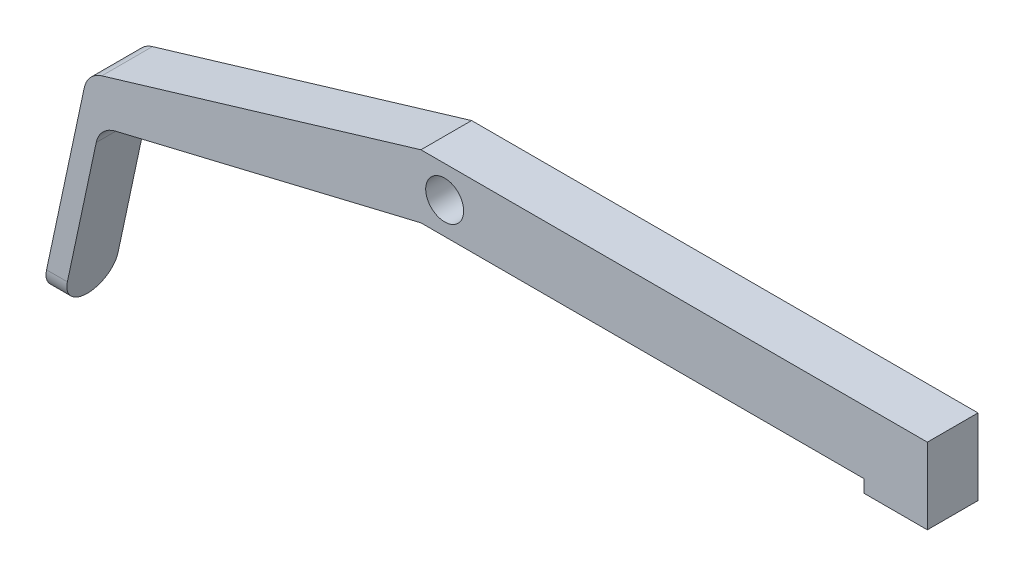
ISO-10303-21;
HEADER;
FILE_DESCRIPTION(('STEP AP214'),'2;1');
FILE_NAME('part.step','',(''),(''),'','','');
FILE_SCHEMA(('AUTOMOTIVE_DESIGN { 1 0 10303 214 1 1 1 1 }'));
ENDSEC;
DATA;
#1=APPLICATION_CONTEXT('core data for automotive mechanical design processes');
#2=APPLICATION_PROTOCOL_DEFINITION('international standard','automotive_design',2000,#1);
#3=PRODUCT_CONTEXT('',#1,'mechanical');
#4=PRODUCT('Part','Part','',(#3));
#5=PRODUCT_RELATED_PRODUCT_CATEGORY('part','',(#4));
#6=PRODUCT_DEFINITION_FORMATION('','',#4);
#7=PRODUCT_DEFINITION_CONTEXT('part definition',#1,'design');
#8=PRODUCT_DEFINITION('design','',#6,#7);
#9=PRODUCT_DEFINITION_SHAPE('','',#8);
#10=(LENGTH_UNIT() NAMED_UNIT(*) SI_UNIT(.MILLI.,.METRE.));
#11=(NAMED_UNIT(*) PLANE_ANGLE_UNIT() SI_UNIT($,.RADIAN.));
#12=(NAMED_UNIT(*) SI_UNIT($,.STERADIAN.) SOLID_ANGLE_UNIT());
#13=UNCERTAINTY_MEASURE_WITH_UNIT(LENGTH_MEASURE(1.E-05),#10,'distance_accuracy_value','');
#14=(GEOMETRIC_REPRESENTATION_CONTEXT(3) GLOBAL_UNCERTAINTY_ASSIGNED_CONTEXT((#13)) GLOBAL_UNIT_ASSIGNED_CONTEXT((#10,
#11,#12)) REPRESENTATION_CONTEXT('',''));
#15=CARTESIAN_POINT('',(0.,0.,0.));
#16=DIRECTION('',(0.,0.,1.));
#17=DIRECTION('',(1.,0.,0.));
#18=AXIS2_PLACEMENT_3D('',#15,#16,#17);
#19=CARTESIAN_POINT('',(-118.155372005352,47.283765903009,8.));
#20=DIRECTION('',(0.,1.,0.));
#21=DIRECTION('',(-1.,0.,0.));
#22=AXIS2_PLACEMENT_3D('',#19,#20,#21);
#23=PLANE('',#22);
#24=DIRECTION('',(0.,0.,-1.));
#25=VECTOR('',#24,1.);
#26=CARTESIAN_POINT('',(-128.155372005352,47.283765903009,0.));
#27=LINE('',#26,#25);
#28=CARTESIAN_POINT('',(-128.155372005352,47.283765903009,8.));
#29=VERTEX_POINT('',#28);
#30=CARTESIAN_POINT('',(-128.155372005352,47.283765903009,6.5));
#31=VERTEX_POINT('',#30);
#32=EDGE_CURVE('E277',#29,#31,#27,.T.);
#33=ORIENTED_EDGE('',*,*,#32,.F.);
#34=DIRECTION('',(1.,0.,0.));
#35=VECTOR('',#34,1.);
#36=CARTESIAN_POINT('',(-118.155372005352,47.283765903009,8.));
#37=LINE('',#36,#35);
#38=CARTESIAN_POINT('',(-198.155372005352,47.2837659030089,8.));
#39=VERTEX_POINT('',#38);
#40=EDGE_CURVE('E186',#39,#29,#37,.T.);
#41=ORIENTED_EDGE('',*,*,#40,.F.);
#42=DIRECTION('',(0.,0.,-1.));
#43=VECTOR('',#42,1.);
#44=CARTESIAN_POINT('',(-198.155372005352,47.2837659030089,8.));
#45=LINE('',#44,#43);
#46=CARTESIAN_POINT('',(-198.155372005352,47.2837659030089,0.));
#47=VERTEX_POINT('',#46);
#48=EDGE_CURVE('E211',#39,#47,#45,.T.);
#49=ORIENTED_EDGE('',*,*,#48,.T.);
#50=DIRECTION('',(1.,0.,0.));
#51=VECTOR('',#50,1.);
#52=CARTESIAN_POINT('',(-118.155372005352,47.283765903009,0.));
#53=LINE('',#52,#51);
#54=CARTESIAN_POINT('',(-128.155372005352,47.283765903009,0.));
#55=VERTEX_POINT('',#54);
#56=EDGE_CURVE('E199',#47,#55,#53,.T.);
#57=ORIENTED_EDGE('',*,*,#56,.T.);
#58=DIRECTION('',(0.,0.,1.));
#59=VECTOR('',#58,1.);
#60=CARTESIAN_POINT('',(-128.155372005352,47.283765903009,0.));
#61=LINE('',#60,#59);
#62=CARTESIAN_POINT('',(-128.155372005352,47.283765903009,1.5));
#63=VERTEX_POINT('',#62);
#64=EDGE_CURVE('E181',#55,#63,#61,.T.);
#65=ORIENTED_EDGE('',*,*,#64,.T.);
#66=DIRECTION('',(-1.,0.,0.));
#67=VECTOR('',#66,1.);
#68=CARTESIAN_POINT('',(0.,47.283765903009,1.50000000000001));
#69=LINE('',#68,#67);
#70=CARTESIAN_POINT('',(-119.655372005352,47.283765903009,1.5));
#71=VERTEX_POINT('',#70);
#72=EDGE_CURVE('E292',#71,#63,#69,.T.);
#73=ORIENTED_EDGE('',*,*,#72,.F.);
#74=DIRECTION('',(0.,0.,-1.));
#75=VECTOR('',#74,1.);
#76=CARTESIAN_POINT('',(-119.655372005352,47.283765903009,0.));
#77=LINE('',#76,#75);
#78=CARTESIAN_POINT('',(-119.655372005352,47.283765903009,6.5));
#79=VERTEX_POINT('',#78);
#80=EDGE_CURVE('E282',#79,#71,#77,.T.);
#81=ORIENTED_EDGE('',*,*,#80,.F.);
#82=DIRECTION('',(-1.,0.,0.));
#83=VECTOR('',#82,1.);
#84=CARTESIAN_POINT('',(0.,47.283765903009,6.49999999999999));
#85=LINE('',#84,#83);
#86=EDGE_CURVE('E279',#79,#31,#85,.T.);
#87=ORIENTED_EDGE('',*,*,#86,.T.);
#88=EDGE_LOOP('',(#33,#41,#49,#57,#65,#73,#81,#87));
#89=FACE_BOUND('',#88,.T.);
#90=ADVANCED_FACE('F38',(#89),#23,.F.);
#91=CARTESIAN_POINT('',(-118.155372005352,57.283765903009,8.));
#92=DIRECTION('',(-1.,0.,0.));
#93=DIRECTION('',(0.,0.,1.));
#94=AXIS2_PLACEMENT_3D('',#91,#92,#93);
#95=PLANE('',#94);
#96=DIRECTION('',(0.,1.,0.));
#97=VECTOR('',#96,1.);
#98=CARTESIAN_POINT('',(-118.155372005352,57.283765903009,0.));
#99=LINE('',#98,#97);
#100=CARTESIAN_POINT('',(-118.155372005352,45.283765903009,0.));
#101=VERTEX_POINT('',#100);
#102=CARTESIAN_POINT('',(-118.155372005352,57.283765903009,0.));
#103=VERTEX_POINT('',#102);
#104=EDGE_CURVE('E187',#101,#103,#99,.T.);
#105=ORIENTED_EDGE('',*,*,#104,.T.);
#106=DIRECTION('',(0.,0.,-1.));
#107=VECTOR('',#106,1.);
#108=CARTESIAN_POINT('',(-118.155372005352,57.283765903009,8.));
#109=LINE('',#108,#107);
#110=CARTESIAN_POINT('',(-118.155372005352,57.283765903009,8.));
#111=VERTEX_POINT('',#110);
#112=EDGE_CURVE('E230',#111,#103,#109,.T.);
#113=ORIENTED_EDGE('',*,*,#112,.F.);
#114=DIRECTION('',(0.,1.,0.));
#115=VECTOR('',#114,1.);
#116=CARTESIAN_POINT('',(-118.155372005352,57.283765903009,8.));
#117=LINE('',#116,#115);
#118=CARTESIAN_POINT('',(-118.155372005352,45.283765903009,8.));
#119=VERTEX_POINT('',#118);
#120=EDGE_CURVE('E196',#119,#111,#117,.T.);
#121=ORIENTED_EDGE('',*,*,#120,.F.);
#122=DIRECTION('',(0.,0.,1.));
#123=VECTOR('',#122,1.);
#124=CARTESIAN_POINT('',(-118.155372005352,45.283765903009,0.));
#125=LINE('',#124,#123);
#126=EDGE_CURVE('E178',#101,#119,#125,.T.);
#127=ORIENTED_EDGE('',*,*,#126,.F.);
#128=EDGE_LOOP('',(#105,#113,#121,#127));
#129=FACE_BOUND('',#128,.T.);
#130=ADVANCED_FACE('F323',(#129),#95,.F.);
#131=CARTESIAN_POINT('',(-118.155372005352,57.283765903009,8.));
#132=DIRECTION('',(0.,-1.,0.));
#133=DIRECTION('',(1.,0.,0.));
#134=AXIS2_PLACEMENT_3D('',#131,#132,#133);
#135=PLANE('',#134);
#136=DIRECTION('',(-1.,0.,0.));
#137=VECTOR('',#136,1.);
#138=CARTESIAN_POINT('',(-118.155372005352,57.283765903009,0.));
#139=LINE('',#138,#137);
#140=CARTESIAN_POINT('',(-198.155372005352,57.283765903009,0.));
#141=VERTEX_POINT('',#140);
#142=EDGE_CURVE('E190',#103,#141,#139,.T.);
#143=ORIENTED_EDGE('',*,*,#142,.T.);
#144=DIRECTION('',(0.,0.,-1.));
#145=VECTOR('',#144,1.);
#146=CARTESIAN_POINT('',(-198.155372005352,57.283765903009,8.));
#147=LINE('',#146,#145);
#148=CARTESIAN_POINT('',(-198.155372005352,57.283765903009,8.));
#149=VERTEX_POINT('',#148);
#150=EDGE_CURVE('E227',#149,#141,#147,.T.);
#151=ORIENTED_EDGE('',*,*,#150,.F.);
#152=DIRECTION('',(-1.,0.,0.));
#153=VECTOR('',#152,1.);
#154=CARTESIAN_POINT('',(-118.155372005352,57.283765903009,8.));
#155=LINE('',#154,#153);
#156=EDGE_CURVE('E198',#111,#149,#155,.T.);
#157=ORIENTED_EDGE('',*,*,#156,.F.);
#158=ORIENTED_EDGE('',*,*,#112,.T.);
#159=EDGE_LOOP('',(#143,#151,#157,#158));
#160=FACE_BOUND('',#159,.T.);
#161=ADVANCED_FACE('F328',(#160),#135,.F.);
#162=CARTESIAN_POINT('',(-198.155372005352,57.283765903009,8.));
#163=DIRECTION('',(0.286761078698048,-0.95800213138799,0.));
#164=DIRECTION('',(0.95800213138799,0.286761078698048,0.));
#165=AXIS2_PLACEMENT_3D('',#162,#163,#164);
#166=PLANE('',#165);
#167=DIRECTION('',(-0.95800213138799,-0.286761078698048,0.));
#168=VECTOR('',#167,1.);
#169=CARTESIAN_POINT('',(-198.155372005352,57.283765903009,0.));
#170=LINE('',#169,#168);
#171=CARTESIAN_POINT('',(-248.575603282018,42.1913569872234,0.));
#172=VERTEX_POINT('',#171);
#173=EDGE_CURVE('E214',#141,#172,#170,.T.);
#174=ORIENTED_EDGE('',*,*,#173,.T.);
#175=DIRECTION('',(0.,0.,-1.));
#176=VECTOR('',#175,1.);
#177=CARTESIAN_POINT('',(-248.575603282018,42.1913569872234,8.));
#178=LINE('',#177,#176);
#179=CARTESIAN_POINT('',(-248.575603282018,42.1913569872234,8.));
#180=VERTEX_POINT('',#179);
#181=EDGE_CURVE('E54',#172,#180,#178,.F.);
#182=ORIENTED_EDGE('',*,*,#181,.T.);
#183=DIRECTION('',(-0.95800213138799,-0.286761078698048,0.));
#184=VECTOR('',#183,1.);
#185=CARTESIAN_POINT('',(-198.155372005352,57.283765903009,8.));
#186=LINE('',#185,#184);
#187=EDGE_CURVE('E201',#149,#180,#186,.T.);
#188=ORIENTED_EDGE('',*,*,#187,.F.);
#189=ORIENTED_EDGE('',*,*,#150,.T.);
#190=EDGE_LOOP('',(#174,#182,#188,#189));
#191=FACE_BOUND('',#190,.T.);
#192=ADVANCED_FACE('F329',(#191),#166,.F.);
#193=CARTESIAN_POINT('',(-250.845489231691,41.5119065746163,8.));
#194=DIRECTION('',(0.977946876331638,-0.208853793533158,0.));
#195=DIRECTION('',(0.208853793533158,0.977946876331639,0.));
#196=AXIS2_PLACEMENT_3D('',#193,#194,#195);
#197=PLANE('',#196);
#198=DIRECTION('',(-0.208853793533158,-0.977946876331638,0.));
#199=VECTOR('',#198,1.);
#200=CARTESIAN_POINT('',(-250.845489231691,41.5119065746163,8.));
#201=LINE('',#200,#199);
#202=CARTESIAN_POINT('',(-251.340346472552,39.1947636358041,8.));
#203=VERTEX_POINT('',#202);
#204=CARTESIAN_POINT('',(-257.301117858883,11.283765903009,8.));
#205=VERTEX_POINT('',#204);
#206=EDGE_CURVE('E203',#203,#205,#201,.T.);
#207=ORIENTED_EDGE('',*,*,#206,.F.);
#208=DIRECTION('',(0.,0.,-1.));
#209=VECTOR('',#208,1.);
#210=CARTESIAN_POINT('',(-251.340346472552,39.1947636358041,8.));
#211=LINE('',#210,#209);
#212=CARTESIAN_POINT('',(-251.340346472552,39.1947636358041,0.));
#213=VERTEX_POINT('',#212);
#214=EDGE_CURVE('E246',#203,#213,#211,.T.);
#215=ORIENTED_EDGE('',*,*,#214,.T.);
#216=DIRECTION('',(-0.208853793533158,-0.977946876331638,0.));
#217=VECTOR('',#216,1.);
#218=CARTESIAN_POINT('',(-250.845489231691,41.5119065746163,0.));
#219=LINE('',#218,#217);
#220=CARTESIAN_POINT('',(-257.301117858883,11.283765903009,0.));
#221=VERTEX_POINT('',#220);
#222=EDGE_CURVE('E216',#213,#221,#219,.T.);
#223=ORIENTED_EDGE('',*,*,#222,.T.);
#224=CARTESIAN_POINT('',(-257.301117858883,11.283765903009,4.));
#225=DIRECTION('',(0.977946876331638,-0.208853793533158,0.));
#226=DIRECTION('',(-0.208853793533158,-0.977946876331639,0.));
#227=AXIS2_PLACEMENT_3D('',#224,#225,#226);
#228=ELLIPSE('',#227,4.09020172445802,4.);
#229=CARTESIAN_POINT('',(-258.155372005352,7.28376590300896,4.));
#230=VERTEX_POINT('',#229);
#231=EDGE_CURVE('E244',#221,#230,#228,.F.);
#232=ORIENTED_EDGE('',*,*,#231,.T.);
#233=CARTESIAN_POINT('',(-257.301117858883,11.283765903009,4.));
#234=DIRECTION('',(0.977946876331638,-0.208853793533158,0.));
#235=DIRECTION('',(0.208853793533158,0.977946876331639,0.));
#236=AXIS2_PLACEMENT_3D('',#233,#234,#235);
#237=ELLIPSE('',#236,4.09020172445802,4.);
#238=EDGE_CURVE('E242',#230,#205,#237,.F.);
#239=ORIENTED_EDGE('',*,*,#238,.T.);
#240=EDGE_LOOP('',(#207,#215,#223,#232,#239));
#241=FACE_BOUND('',#240,.T.);
#242=ADVANCED_FACE('F331',(#241),#197,.F.);
#243=CARTESIAN_POINT('',(-248.926231581606,35.1001127293261,8.));
#244=DIRECTION('',(-0.977946876331638,0.208853793533158,0.));
#245=DIRECTION('',(-0.208853793533158,-0.977946876331639,0.));
#246=AXIS2_PLACEMENT_3D('',#243,#244,#245);
#247=PLANE('',#246);
#248=DIRECTION('',(0.208853793533158,0.977946876331638,0.));
#249=VECTOR('',#248,1.);
#250=CARTESIAN_POINT('',(-248.926231581606,35.1001127293261,0.));
#251=LINE('',#250,#249);
#252=CARTESIAN_POINT('',(-254.012534839136,11.283765903009,0.));
#253=VERTEX_POINT('',#252);
#254=CARTESIAN_POINT('',(-249.452835110038,32.6343194727909,0.));
#255=VERTEX_POINT('',#254);
#256=EDGE_CURVE('E219',#253,#255,#251,.T.);
#257=ORIENTED_EDGE('',*,*,#256,.T.);
#258=DIRECTION('',(0.,0.,-1.));
#259=VECTOR('',#258,1.);
#260=CARTESIAN_POINT('',(-249.452835110038,32.6343194727909,8.));
#261=LINE('',#260,#259);
#262=CARTESIAN_POINT('',(-249.452835110038,32.6343194727909,8.));
#263=VERTEX_POINT('',#262);
#264=EDGE_CURVE('E240',#255,#263,#261,.F.);
#265=ORIENTED_EDGE('',*,*,#264,.T.);
#266=DIRECTION('',(0.208853793533158,0.977946876331638,0.));
#267=VECTOR('',#266,1.);
#268=CARTESIAN_POINT('',(-248.926231581606,35.1001127293261,8.));
#269=LINE('',#268,#267);
#270=CARTESIAN_POINT('',(-254.012534839136,11.283765903009,8.));
#271=VERTEX_POINT('',#270);
#272=EDGE_CURVE('E206',#271,#263,#269,.T.);
#273=ORIENTED_EDGE('',*,*,#272,.F.);
#274=CARTESIAN_POINT('',(-254.012534839136,11.283765903009,4.));
#275=DIRECTION('',(-0.977946876331638,0.208853793533158,0.));
#276=DIRECTION('',(0.208853793533158,0.977946876331639,0.));
#277=AXIS2_PLACEMENT_3D('',#274,#275,#276);
#278=ELLIPSE('',#277,4.09020172445802,4.);
#279=CARTESIAN_POINT('',(-254.866788985605,7.28376590300896,4.));
#280=VERTEX_POINT('',#279);
#281=EDGE_CURVE('E236',#271,#280,#278,.F.);
#282=ORIENTED_EDGE('',*,*,#281,.T.);
#283=CARTESIAN_POINT('',(-254.012534839136,11.283765903009,4.));
#284=DIRECTION('',(-0.977946876331638,0.208853793533158,0.));
#285=DIRECTION('',(-0.208853793533158,-0.977946876331639,0.));
#286=AXIS2_PLACEMENT_3D('',#283,#284,#285);
#287=ELLIPSE('',#286,4.09020172445802,4.);
#288=EDGE_CURVE('E238',#280,#253,#287,.F.);
#289=ORIENTED_EDGE('',*,*,#288,.T.);
#290=EDGE_LOOP('',(#257,#265,#273,#282,#289));
#291=FACE_BOUND('',#290,.T.);
#292=ADVANCED_FACE('F267',(#291),#247,.F.);
#293=CARTESIAN_POINT('',(-198.155372005352,47.2837659030089,8.));
#294=DIRECTION('',(-0.233348448019879,0.972393182723282,0.));
#295=DIRECTION('',(-0.972393182723282,-0.233348448019879,0.));
#296=AXIS2_PLACEMENT_3D('',#293,#294,#295);
#297=PLANE('',#296);
#298=DIRECTION('',(0.972393182723282,0.233348448019879,0.));
#299=VECTOR('',#298,1.);
#300=CARTESIAN_POINT('',(-198.155372005352,47.2837659030089,8.));
#301=LINE('',#300,#299);
#302=CARTESIAN_POINT('',(-246.474441396791,35.6884770295514,8.));
#303=VERTEX_POINT('',#302);
#304=EDGE_CURVE('E209',#303,#39,#301,.T.);
#305=ORIENTED_EDGE('',*,*,#304,.F.);
#306=DIRECTION('',(0.,0.,-1.));
#307=VECTOR('',#306,1.);
#308=CARTESIAN_POINT('',(-246.474441396791,35.6884770295514,0.));
#309=LINE('',#308,#307);
#310=CARTESIAN_POINT('',(-246.474441396791,35.6884770295514,0.));
#311=VERTEX_POINT('',#310);
#312=EDGE_CURVE('E233',#303,#311,#309,.T.);
#313=ORIENTED_EDGE('',*,*,#312,.T.);
#314=DIRECTION('',(0.972393182723282,0.233348448019879,0.));
#315=VECTOR('',#314,1.);
#316=CARTESIAN_POINT('',(-198.155372005352,47.2837659030089,0.));
#317=LINE('',#316,#315);
#318=EDGE_CURVE('E222',#311,#47,#317,.T.);
#319=ORIENTED_EDGE('',*,*,#318,.T.);
#320=ORIENTED_EDGE('',*,*,#48,.F.);
#321=EDGE_LOOP('',(#305,#313,#319,#320));
#322=FACE_BOUND('',#321,.T.);
#323=ADVANCED_FACE('F275',(#322),#297,.F.);
#324=CARTESIAN_POINT('',(0.,0.,8.));
#325=DIRECTION('',(0.,0.,-1.));
#326=DIRECTION('',(-1.,0.,0.));
#327=AXIS2_PLACEMENT_3D('',#324,#325,#326);
#328=PLANE('',#327);
#329=CARTESIAN_POINT('',(-194.405761522384,52.2863882838188,8.));
#330=DIRECTION('',(0.,0.,1.));
#331=DIRECTION('',(1.,0.,0.));
#332=AXIS2_PLACEMENT_3D('',#329,#330,#331);
#333=CIRCLE('',#332,2.99999999999999);
#334=CARTESIAN_POINT('',(-191.405761522384,52.2863882838188,8.));
#335=VERTEX_POINT('',#334);
#336=EDGE_CURVE('E285',#335,#335,#333,.T.);
#337=ORIENTED_EDGE('',*,*,#336,.F.);
#338=EDGE_LOOP('',(#337));
#339=FACE_BOUND('',#338,.T.);
#340=ORIENTED_EDGE('',*,*,#187,.T.);
#341=CARTESIAN_POINT('',(-247.428558967225,38.3593484616714,8.));
#342=DIRECTION('',(0.,0.,-1.));
#343=DIRECTION('',(-1.,0.,0.));
#344=AXIS2_PLACEMENT_3D('',#341,#342,#343);
#345=CIRCLE('',#344,4.);
#346=EDGE_CURVE('E256',#180,#203,#345,.F.);
#347=ORIENTED_EDGE('',*,*,#346,.T.);
#348=ORIENTED_EDGE('',*,*,#206,.T.);
#349=DIRECTION('',(1.,0.,0.));
#350=VECTOR('',#349,1.);
#351=CARTESIAN_POINT('',(0.,11.283765903009,8.));
#352=LINE('',#351,#350);
#353=EDGE_CURVE('E254',#205,#271,#352,.T.);
#354=ORIENTED_EDGE('',*,*,#353,.T.);
#355=ORIENTED_EDGE('',*,*,#272,.T.);
#356=CARTESIAN_POINT('',(-245.541047604712,31.7989042986583,8.));
#357=DIRECTION('',(0.,0.,-1.));
#358=DIRECTION('',(-1.,0.,0.));
#359=AXIS2_PLACEMENT_3D('',#356,#357,#358);
#360=CIRCLE('',#359,4.);
#361=EDGE_CURVE('E11',#263,#303,#360,.T.);
#362=ORIENTED_EDGE('',*,*,#361,.T.);
#363=ORIENTED_EDGE('',*,*,#304,.T.);
#364=ORIENTED_EDGE('',*,*,#40,.T.);
#365=DIRECTION('',(0.,1.,0.));
#366=VECTOR('',#365,1.);
#367=CARTESIAN_POINT('',(-128.155372005352,45.283765903009,8.));
#368=LINE('',#367,#366);
#369=CARTESIAN_POINT('',(-128.155372005352,45.283765903009,8.));
#370=VERTEX_POINT('',#369);
#371=EDGE_CURVE('E164',#370,#29,#368,.T.);
#372=ORIENTED_EDGE('',*,*,#371,.F.);
#373=DIRECTION('',(-1.,0.,0.));
#374=VECTOR('',#373,1.);
#375=CARTESIAN_POINT('',(0.,45.283765903009,8.));
#376=LINE('',#375,#374);
#377=EDGE_CURVE('E171',#119,#370,#376,.T.);
#378=ORIENTED_EDGE('',*,*,#377,.F.);
#379=ORIENTED_EDGE('',*,*,#120,.T.);
#380=ORIENTED_EDGE('',*,*,#156,.T.);
#381=EDGE_LOOP('',(#340,#347,#348,#354,#355,#362,#363,#364,#372,#378,#379,#380));
#382=FACE_BOUND('',#381,.T.);
#383=ADVANCED_FACE('F184',(#339,#382),#328,.F.);
#384=CARTESIAN_POINT('',(0.,0.,0.));
#385=DIRECTION('',(0.,0.,-1.));
#386=DIRECTION('',(-1.,0.,0.));
#387=AXIS2_PLACEMENT_3D('',#384,#385,#386);
#388=PLANE('',#387);
#389=CARTESIAN_POINT('',(-194.405761522384,52.2863882838188,0.));
#390=DIRECTION('',(0.,0.,1.));
#391=DIRECTION('',(1.,0.,0.));
#392=AXIS2_PLACEMENT_3D('',#389,#390,#391);
#393=CIRCLE('',#392,2.99999999999999);
#394=CARTESIAN_POINT('',(-191.405761522384,52.2863882838188,0.));
#395=VERTEX_POINT('',#394);
#396=EDGE_CURVE('E280',#395,#395,#393,.T.);
#397=ORIENTED_EDGE('',*,*,#396,.T.);
#398=EDGE_LOOP('',(#397));
#399=FACE_BOUND('',#398,.T.);
#400=ORIENTED_EDGE('',*,*,#222,.F.);
#401=CARTESIAN_POINT('',(-247.428558967225,38.3593484616714,0.));
#402=DIRECTION('',(0.,0.,-1.));
#403=DIRECTION('',(-1.,0.,0.));
#404=AXIS2_PLACEMENT_3D('',#401,#402,#403);
#405=CIRCLE('',#404,4.);
#406=EDGE_CURVE('E62',#213,#172,#405,.T.);
#407=ORIENTED_EDGE('',*,*,#406,.T.);
#408=ORIENTED_EDGE('',*,*,#173,.F.);
#409=ORIENTED_EDGE('',*,*,#142,.F.);
#410=ORIENTED_EDGE('',*,*,#104,.F.);
#411=DIRECTION('',(1.,0.,0.));
#412=VECTOR('',#411,1.);
#413=CARTESIAN_POINT('',(0.,45.283765903009,0.));
#414=LINE('',#413,#412);
#415=CARTESIAN_POINT('',(-128.155372005352,45.283765903009,0.));
#416=VERTEX_POINT('',#415);
#417=EDGE_CURVE('E319',#416,#101,#414,.T.);
#418=ORIENTED_EDGE('',*,*,#417,.F.);
#419=DIRECTION('',(0.,1.,0.));
#420=VECTOR('',#419,1.);
#421=CARTESIAN_POINT('',(-128.155372005352,45.283765903009,0.));
#422=LINE('',#421,#420);
#423=EDGE_CURVE('E296',#416,#55,#422,.T.);
#424=ORIENTED_EDGE('',*,*,#423,.T.);
#425=ORIENTED_EDGE('',*,*,#56,.F.);
#426=ORIENTED_EDGE('',*,*,#318,.F.);
#427=CARTESIAN_POINT('',(-245.541047604712,31.7989042986583,0.));
#428=DIRECTION('',(0.,0.,-1.));
#429=DIRECTION('',(-1.,0.,0.));
#430=AXIS2_PLACEMENT_3D('',#427,#428,#429);
#431=CIRCLE('',#430,4.);
#432=EDGE_CURVE('E47',#311,#255,#431,.F.);
#433=ORIENTED_EDGE('',*,*,#432,.T.);
#434=ORIENTED_EDGE('',*,*,#256,.F.);
#435=DIRECTION('',(1.,0.,0.));
#436=VECTOR('',#435,1.);
#437=CARTESIAN_POINT('',(-258.155372005352,11.283765903009,0.));
#438=LINE('',#437,#436);
#439=EDGE_CURVE('E249',#253,#221,#438,.F.);
#440=ORIENTED_EDGE('',*,*,#439,.T.);
#441=EDGE_LOOP('',(#400,#407,#408,#409,#410,#418,#424,#425,#426,#433,#434,#440));
#442=FACE_BOUND('',#441,.T.);
#443=ADVANCED_FACE('F260',(#399,#442),#388,.T.);
#444=CARTESIAN_POINT('',(-128.155372005352,45.283765903009,0.));
#445=DIRECTION('',(1.,0.,0.));
#446=DIRECTION('',(0.,1.,0.));
#447=AXIS2_PLACEMENT_3D('',#444,#445,#446);
#448=PLANE('',#447);
#449=ORIENTED_EDGE('',*,*,#32,.T.);
#450=DIRECTION('',(0.,1.,0.));
#451=VECTOR('',#450,1.);
#452=CARTESIAN_POINT('',(-128.155372005352,45.283765903009,6.5));
#453=LINE('',#452,#451);
#454=CARTESIAN_POINT('',(-128.155372005352,45.283765903009,6.5));
#455=VERTEX_POINT('',#454);
#456=EDGE_CURVE('E166',#455,#31,#453,.T.);
#457=ORIENTED_EDGE('',*,*,#456,.F.);
#458=DIRECTION('',(0.,0.,-1.));
#459=VECTOR('',#458,1.);
#460=CARTESIAN_POINT('',(-128.155372005352,45.283765903009,0.));
#461=LINE('',#460,#459);
#462=EDGE_CURVE('E159',#370,#455,#461,.T.);
#463=ORIENTED_EDGE('',*,*,#462,.F.);
#464=ORIENTED_EDGE('',*,*,#371,.T.);
#465=EDGE_LOOP('',(#449,#457,#463,#464));
#466=FACE_BOUND('',#465,.T.);
#467=ADVANCED_FACE('F162',(#466),#448,.F.);
#468=CARTESIAN_POINT('',(0.,45.283765903009,6.49999999999999));
#469=DIRECTION('',(0.,0.,-1.));
#470=DIRECTION('',(-1.,0.,0.));
#471=AXIS2_PLACEMENT_3D('',#468,#469,#470);
#472=PLANE('',#471);
#473=ORIENTED_EDGE('',*,*,#86,.F.);
#474=DIRECTION('',(0.,1.,0.));
#475=VECTOR('',#474,1.);
#476=CARTESIAN_POINT('',(-119.655372005352,45.283765903009,6.5));
#477=LINE('',#476,#475);
#478=CARTESIAN_POINT('',(-119.655372005352,45.283765903009,6.5));
#479=VERTEX_POINT('',#478);
#480=EDGE_CURVE('E192',#479,#79,#477,.T.);
#481=ORIENTED_EDGE('',*,*,#480,.F.);
#482=DIRECTION('',(-1.,0.,0.));
#483=VECTOR('',#482,1.);
#484=CARTESIAN_POINT('',(0.,45.283765903009,6.49999999999999));
#485=LINE('',#484,#483);
#486=EDGE_CURVE('E170',#479,#455,#485,.T.);
#487=ORIENTED_EDGE('',*,*,#486,.T.);
#488=ORIENTED_EDGE('',*,*,#456,.T.);
#489=EDGE_LOOP('',(#473,#481,#487,#488));
#490=FACE_BOUND('',#489,.T.);
#491=ADVANCED_FACE('F311',(#490),#472,.T.);
#492=CARTESIAN_POINT('',(-119.655372005352,45.283765903009,0.));
#493=DIRECTION('',(1.,0.,0.));
#494=DIRECTION('',(0.,1.,0.));
#495=AXIS2_PLACEMENT_3D('',#492,#493,#494);
#496=PLANE('',#495);
#497=ORIENTED_EDGE('',*,*,#80,.T.);
#498=DIRECTION('',(0.,1.,0.));
#499=VECTOR('',#498,1.);
#500=CARTESIAN_POINT('',(-119.655372005352,45.283765903009,1.5));
#501=LINE('',#500,#499);
#502=CARTESIAN_POINT('',(-119.655372005352,45.283765903009,1.5));
#503=VERTEX_POINT('',#502);
#504=EDGE_CURVE('E302',#503,#71,#501,.T.);
#505=ORIENTED_EDGE('',*,*,#504,.F.);
#506=DIRECTION('',(0.,0.,-1.));
#507=VECTOR('',#506,1.);
#508=CARTESIAN_POINT('',(-119.655372005352,45.283765903009,0.));
#509=LINE('',#508,#507);
#510=EDGE_CURVE('E309',#479,#503,#509,.T.);
#511=ORIENTED_EDGE('',*,*,#510,.F.);
#512=ORIENTED_EDGE('',*,*,#480,.T.);
#513=EDGE_LOOP('',(#497,#505,#511,#512));
#514=FACE_BOUND('',#513,.T.);
#515=ADVANCED_FACE('F307',(#514),#496,.F.);
#516=CARTESIAN_POINT('',(0.,45.283765903009,1.50000000000001));
#517=DIRECTION('',(0.,0.,-1.));
#518=DIRECTION('',(-1.,0.,0.));
#519=AXIS2_PLACEMENT_3D('',#516,#517,#518);
#520=PLANE('',#519);
#521=ORIENTED_EDGE('',*,*,#72,.T.);
#522=DIRECTION('',(0.,1.,0.));
#523=VECTOR('',#522,1.);
#524=CARTESIAN_POINT('',(-128.155372005352,45.283765903009,1.5));
#525=LINE('',#524,#523);
#526=CARTESIAN_POINT('',(-128.155372005352,45.283765903009,1.5));
#527=VERTEX_POINT('',#526);
#528=EDGE_CURVE('E299',#527,#63,#525,.T.);
#529=ORIENTED_EDGE('',*,*,#528,.F.);
#530=DIRECTION('',(-1.,0.,0.));
#531=VECTOR('',#530,1.);
#532=CARTESIAN_POINT('',(0.,45.283765903009,1.50000000000001));
#533=LINE('',#532,#531);
#534=EDGE_CURVE('E313',#503,#527,#533,.T.);
#535=ORIENTED_EDGE('',*,*,#534,.F.);
#536=ORIENTED_EDGE('',*,*,#504,.T.);
#537=EDGE_LOOP('',(#521,#529,#535,#536));
#538=FACE_BOUND('',#537,.T.);
#539=ADVANCED_FACE('F392',(#538),#520,.F.);
#540=CARTESIAN_POINT('',(-128.155372005352,45.283765903009,0.));
#541=DIRECTION('',(-1.,0.,0.));
#542=DIRECTION('',(0.,-1.,0.));
#543=AXIS2_PLACEMENT_3D('',#540,#541,#542);
#544=PLANE('',#543);
#545=ORIENTED_EDGE('',*,*,#64,.F.);
#546=ORIENTED_EDGE('',*,*,#423,.F.);
#547=DIRECTION('',(0.,0.,1.));
#548=VECTOR('',#547,1.);
#549=CARTESIAN_POINT('',(-128.155372005352,45.283765903009,0.));
#550=LINE('',#549,#548);
#551=EDGE_CURVE('E317',#416,#527,#550,.T.);
#552=ORIENTED_EDGE('',*,*,#551,.T.);
#553=ORIENTED_EDGE('',*,*,#528,.T.);
#554=EDGE_LOOP('',(#545,#546,#552,#553));
#555=FACE_BOUND('',#554,.T.);
#556=ADVANCED_FACE('F399',(#555),#544,.T.);
#557=CARTESIAN_POINT('',(0.,45.283765903009,0.));
#558=DIRECTION('',(0.,-1.,0.));
#559=DIRECTION('',(1.,0.,0.));
#560=AXIS2_PLACEMENT_3D('',#557,#558,#559);
#561=PLANE('',#560);
#562=ORIENTED_EDGE('',*,*,#377,.T.);
#563=ORIENTED_EDGE('',*,*,#462,.T.);
#564=ORIENTED_EDGE('',*,*,#486,.F.);
#565=ORIENTED_EDGE('',*,*,#510,.T.);
#566=ORIENTED_EDGE('',*,*,#534,.T.);
#567=ORIENTED_EDGE('',*,*,#551,.F.);
#568=ORIENTED_EDGE('',*,*,#417,.T.);
#569=ORIENTED_EDGE('',*,*,#126,.T.);
#570=EDGE_LOOP('',(#562,#563,#564,#565,#566,#567,#568,#569));
#571=FACE_BOUND('',#570,.T.);
#572=ADVANCED_FACE('F175',(#571),#561,.T.);
#573=CARTESIAN_POINT('',(-194.405761522384,52.2863882838188,0.));
#574=DIRECTION('',(0.,0.,1.));
#575=DIRECTION('',(1.,0.,0.));
#576=AXIS2_PLACEMENT_3D('',#573,#574,#575);
#577=CYLINDRICAL_SURFACE('',#576,2.99999999999999);
#578=ORIENTED_EDGE('',*,*,#396,.F.);
#579=EDGE_LOOP('',(#578));
#580=FACE_BOUND('',#579,.T.);
#581=ORIENTED_EDGE('',*,*,#336,.T.);
#582=EDGE_LOOP('',(#581));
#583=FACE_BOUND('',#582,.T.);
#584=ADVANCED_FACE('F414',(#580,#583),#577,.F.);
#585=CARTESIAN_POINT('',(-245.541047604712,31.7989042986583,8.));
#586=DIRECTION('',(0.,0.,1.));
#587=DIRECTION('',(1.,0.,0.));
#588=AXIS2_PLACEMENT_3D('',#585,#586,#587);
#589=CYLINDRICAL_SURFACE('',#588,4.);
#590=ORIENTED_EDGE('',*,*,#361,.F.);
#591=ORIENTED_EDGE('',*,*,#264,.F.);
#592=ORIENTED_EDGE('',*,*,#432,.F.);
#593=ORIENTED_EDGE('',*,*,#312,.F.);
#594=EDGE_LOOP('',(#590,#591,#592,#593));
#595=FACE_BOUND('',#594,.T.);
#596=ADVANCED_FACE('F271',(#595),#589,.F.);
#597=CARTESIAN_POINT('',(-247.428558967225,38.3593484616714,8.));
#598=DIRECTION('',(0.,0.,-1.));
#599=DIRECTION('',(-1.,0.,0.));
#600=AXIS2_PLACEMENT_3D('',#597,#598,#599);
#601=CYLINDRICAL_SURFACE('',#600,4.);
#602=ORIENTED_EDGE('',*,*,#346,.F.);
#603=ORIENTED_EDGE('',*,*,#181,.F.);
#604=ORIENTED_EDGE('',*,*,#406,.F.);
#605=ORIENTED_EDGE('',*,*,#214,.F.);
#606=EDGE_LOOP('',(#602,#603,#604,#605));
#607=FACE_BOUND('',#606,.T.);
#608=ADVANCED_FACE('F427',(#607),#601,.T.);
#609=CARTESIAN_POINT('',(0.,11.283765903009,4.));
#610=DIRECTION('',(1.,0.,0.));
#611=DIRECTION('',(0.,0.,-1.));
#612=AXIS2_PLACEMENT_3D('',#609,#610,#611);
#613=CYLINDRICAL_SURFACE('',#612,4.);
#614=ORIENTED_EDGE('',*,*,#353,.F.);
#615=ORIENTED_EDGE('',*,*,#238,.F.);
#616=DIRECTION('',(1.,0.,0.));
#617=VECTOR('',#616,1.);
#618=CARTESIAN_POINT('',(-254.866788985605,7.28376590300896,4.));
#619=LINE('',#618,#617);
#620=EDGE_CURVE('E42',#280,#230,#619,.F.);
#621=ORIENTED_EDGE('',*,*,#620,.F.);
#622=ORIENTED_EDGE('',*,*,#281,.F.);
#623=EDGE_LOOP('',(#614,#615,#621,#622));
#624=FACE_BOUND('',#623,.T.);
#625=ADVANCED_FACE('F40',(#624),#613,.T.);
#626=CARTESIAN_POINT('',(-254.866788985605,11.283765903009,4.));
#627=DIRECTION('',(-1.,0.,0.));
#628=DIRECTION('',(0.,0.,1.));
#629=AXIS2_PLACEMENT_3D('',#626,#627,#628);
#630=CYLINDRICAL_SURFACE('',#629,4.);
#631=ORIENTED_EDGE('',*,*,#231,.F.);
#632=ORIENTED_EDGE('',*,*,#439,.F.);
#633=ORIENTED_EDGE('',*,*,#288,.F.);
#634=ORIENTED_EDGE('',*,*,#620,.T.);
#635=EDGE_LOOP('',(#631,#632,#633,#634));
#636=FACE_BOUND('',#635,.T.);
#637=ADVANCED_FACE('F441',(#636),#630,.T.);
#638=CLOSED_SHELL('',(#90,#130,#161,#192,#242,#292,#323,#383,#443,#467,#491,#515,#539,#556,#572,
#584,#596,#608,#625,#637));
#639=MANIFOLD_SOLID_BREP('B2',#638);
#640=ADVANCED_BREP_SHAPE_REPRESENTATION('',(#18,#639),#14);
#641=SHAPE_DEFINITION_REPRESENTATION(#9,#640);
ENDSEC;
END-ISO-10303-21;
